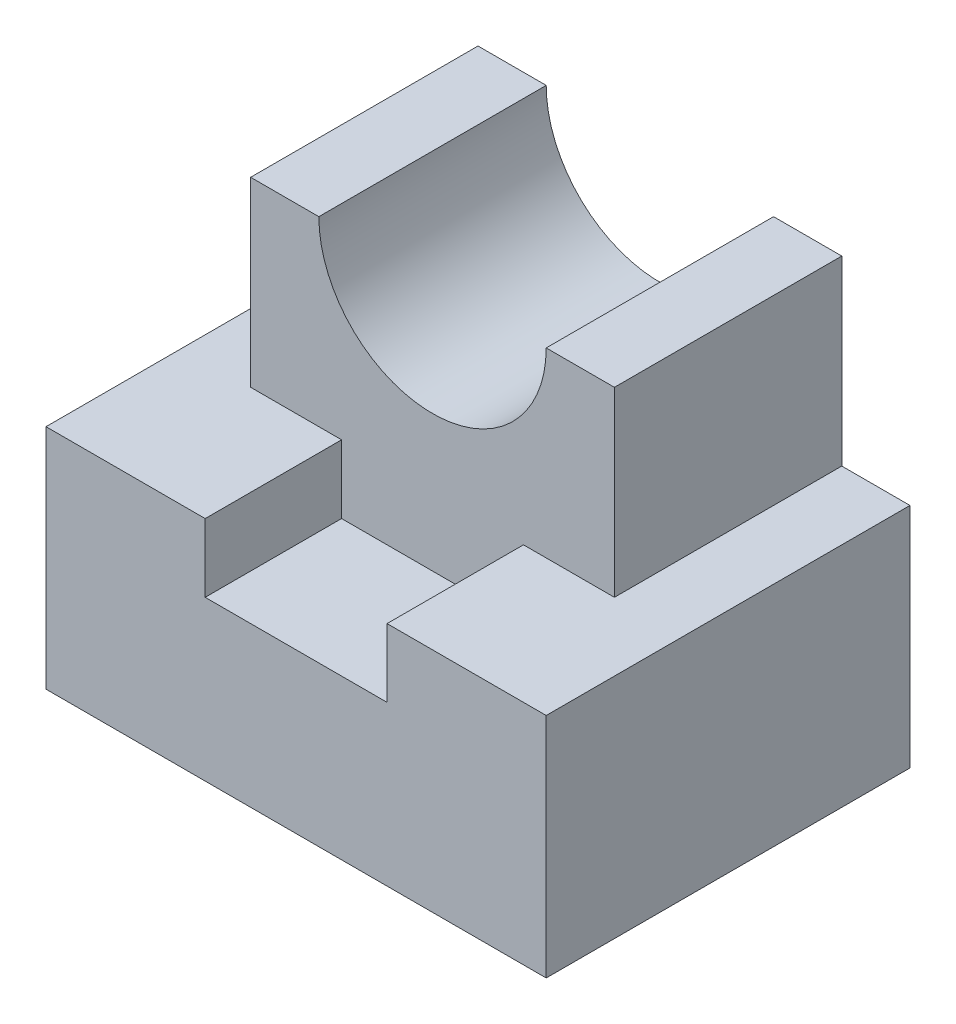
ISO-10303-21;
HEADER;
FILE_DESCRIPTION(('STEP AP214'),'2;1');
FILE_NAME('part.step','',(''),(''),'','','');
FILE_SCHEMA(('AUTOMOTIVE_DESIGN { 1 0 10303 214 1 1 1 1 }'));
ENDSEC;
DATA;
#1=APPLICATION_CONTEXT('core data for automotive mechanical design processes');
#2=APPLICATION_PROTOCOL_DEFINITION('international standard','automotive_design',2000,#1);
#3=PRODUCT_CONTEXT('',#1,'mechanical');
#4=PRODUCT('Part','Part','',(#3));
#5=PRODUCT_RELATED_PRODUCT_CATEGORY('part','',(#4));
#6=PRODUCT_DEFINITION_FORMATION('','',#4);
#7=PRODUCT_DEFINITION_CONTEXT('part definition',#1,'design');
#8=PRODUCT_DEFINITION('design','',#6,#7);
#9=PRODUCT_DEFINITION_SHAPE('','',#8);
#10=(LENGTH_UNIT() NAMED_UNIT(*) SI_UNIT(.MILLI.,.METRE.));
#11=(NAMED_UNIT(*) PLANE_ANGLE_UNIT() SI_UNIT($,.RADIAN.));
#12=(NAMED_UNIT(*) SI_UNIT($,.STERADIAN.) SOLID_ANGLE_UNIT());
#13=UNCERTAINTY_MEASURE_WITH_UNIT(LENGTH_MEASURE(1.E-05),#10,'distance_accuracy_value','');
#14=(GEOMETRIC_REPRESENTATION_CONTEXT(3) GLOBAL_UNCERTAINTY_ASSIGNED_CONTEXT((#13)) GLOBAL_UNIT_ASSIGNED_CONTEXT((#10,
#11,#12)) REPRESENTATION_CONTEXT('',''));
#15=CARTESIAN_POINT('',(0.,0.,0.));
#16=DIRECTION('',(0.,0.,1.));
#17=DIRECTION('',(1.,0.,0.));
#18=AXIS2_PLACEMENT_3D('',#15,#16,#17);
#19=CARTESIAN_POINT('',(0.,50.,0.));
#20=DIRECTION('',(0.,1.,0.));
#21=DIRECTION('',(0.,0.,1.));
#22=AXIS2_PLACEMENT_3D('',#19,#20,#21);
#23=PLANE('',#22);
#24=DIRECTION('',(0.,0.,1.));
#25=VECTOR('',#24,1.);
#26=CARTESIAN_POINT('',(-20.,50.,-32.7200187265876));
#27=LINE('',#26,#25);
#28=CARTESIAN_POINT('',(-20.,50.,10.));
#29=VERTEX_POINT('',#28);
#30=CARTESIAN_POINT('',(-20.,50.,40.));
#31=VERTEX_POINT('',#30);
#32=EDGE_CURVE('E141',#29,#31,#27,.T.);
#33=ORIENTED_EDGE('',*,*,#32,.F.);
#34=DIRECTION('',(1.,0.,0.));
#35=VECTOR('',#34,1.);
#36=CARTESIAN_POINT('',(0.,50.,10.));
#37=LINE('',#36,#35);
#38=CARTESIAN_POINT('',(-40.,50.,10.));
#39=VERTEX_POINT('',#38);
#40=EDGE_CURVE('E196',#39,#29,#37,.T.);
#41=ORIENTED_EDGE('',*,*,#40,.F.);
#42=DIRECTION('',(0.,0.,1.));
#43=VECTOR('',#42,1.);
#44=CARTESIAN_POINT('',(-40.,50.,0.));
#45=LINE('',#44,#43);
#46=CARTESIAN_POINT('',(-40.,50.,-40.));
#47=VERTEX_POINT('',#46);
#48=EDGE_CURVE('E198',#47,#39,#45,.T.);
#49=ORIENTED_EDGE('',*,*,#48,.F.);
#50=DIRECTION('',(-1.,0.,0.));
#51=VECTOR('',#50,1.);
#52=CARTESIAN_POINT('',(-55.,50.,-40.));
#53=LINE('',#52,#51);
#54=CARTESIAN_POINT('',(-55.,50.,-40.));
#55=VERTEX_POINT('',#54);
#56=EDGE_CURVE('E212',#47,#55,#53,.T.);
#57=ORIENTED_EDGE('',*,*,#56,.T.);
#58=DIRECTION('',(0.,0.,1.));
#59=VECTOR('',#58,1.);
#60=CARTESIAN_POINT('',(-55.,50.,-40.));
#61=LINE('',#60,#59);
#62=CARTESIAN_POINT('',(-55.,50.,40.));
#63=VERTEX_POINT('',#62);
#64=EDGE_CURVE('E202',#55,#63,#61,.T.);
#65=ORIENTED_EDGE('',*,*,#64,.T.);
#66=DIRECTION('',(1.,0.,0.));
#67=VECTOR('',#66,1.);
#68=CARTESIAN_POINT('',(-55.,50.,40.));
#69=LINE('',#68,#67);
#70=EDGE_CURVE('E207',#63,#31,#69,.T.);
#71=ORIENTED_EDGE('',*,*,#70,.T.);
#72=EDGE_LOOP('',(#33,#41,#49,#57,#65,#71));
#73=FACE_BOUND('',#72,.T.);
#74=ADVANCED_FACE('F33',(#73),#23,.T.);
#75=CARTESIAN_POINT('',(0.,90.,0.));
#76=DIRECTION('',(0.,1.,0.));
#77=DIRECTION('',(0.,0.,1.));
#78=AXIS2_PLACEMENT_3D('',#75,#76,#77);
#79=PLANE('',#78);
#80=DIRECTION('',(0.,0.,-1.));
#81=VECTOR('',#80,1.);
#82=CARTESIAN_POINT('',(25.,90.,40.));
#83=LINE('',#82,#81);
#84=CARTESIAN_POINT('',(25.,90.,10.));
#85=VERTEX_POINT('',#84);
#86=CARTESIAN_POINT('',(25.,90.,-40.));
#87=VERTEX_POINT('',#86);
#88=EDGE_CURVE('E41',#85,#87,#83,.T.);
#89=ORIENTED_EDGE('',*,*,#88,.F.);
#90=DIRECTION('',(-1.,0.,0.));
#91=VECTOR('',#90,1.);
#92=CARTESIAN_POINT('',(-40.,90.,10.));
#93=LINE('',#92,#91);
#94=CARTESIAN_POINT('',(40.,90.,10.));
#95=VERTEX_POINT('',#94);
#96=EDGE_CURVE('E177',#95,#85,#93,.T.);
#97=ORIENTED_EDGE('',*,*,#96,.F.);
#98=DIRECTION('',(0.,0.,1.));
#99=VECTOR('',#98,1.);
#100=CARTESIAN_POINT('',(40.,90.,-40.));
#101=LINE('',#100,#99);
#102=CARTESIAN_POINT('',(40.,90.,-40.));
#103=VERTEX_POINT('',#102);
#104=EDGE_CURVE('E173',#103,#95,#101,.T.);
#105=ORIENTED_EDGE('',*,*,#104,.F.);
#106=DIRECTION('',(1.,0.,0.));
#107=VECTOR('',#106,1.);
#108=CARTESIAN_POINT('',(-40.,90.,-40.));
#109=LINE('',#108,#107);
#110=EDGE_CURVE('E169',#87,#103,#109,.T.);
#111=ORIENTED_EDGE('',*,*,#110,.F.);
#112=EDGE_LOOP('',(#89,#97,#105,#111));
#113=FACE_BOUND('',#112,.T.);
#114=ADVANCED_FACE('F245',(#113),#79,.T.);
#115=CARTESIAN_POINT('',(-55.,50.,-40.));
#116=DIRECTION('',(1.,0.,0.));
#117=DIRECTION('',(0.,0.,-1.));
#118=AXIS2_PLACEMENT_3D('',#115,#116,#117);
#119=PLANE('',#118);
#120=DIRECTION('',(0.,0.,1.));
#121=VECTOR('',#120,1.);
#122=CARTESIAN_POINT('',(-55.,0.,-40.));
#123=LINE('',#122,#121);
#124=CARTESIAN_POINT('',(-55.,0.,-40.));
#125=VERTEX_POINT('',#124);
#126=CARTESIAN_POINT('',(-55.,0.,40.));
#127=VERTEX_POINT('',#126);
#128=EDGE_CURVE('E201',#125,#127,#123,.T.);
#129=ORIENTED_EDGE('',*,*,#128,.T.);
#130=DIRECTION('',(0.,-1.,0.));
#131=VECTOR('',#130,1.);
#132=CARTESIAN_POINT('',(-55.,50.,40.));
#133=LINE('',#132,#131);
#134=EDGE_CURVE('E231',#63,#127,#133,.T.);
#135=ORIENTED_EDGE('',*,*,#134,.F.);
#136=ORIENTED_EDGE('',*,*,#64,.F.);
#137=DIRECTION('',(0.,-1.,0.));
#138=VECTOR('',#137,1.);
#139=CARTESIAN_POINT('',(-55.,50.,-40.));
#140=LINE('',#139,#138);
#141=EDGE_CURVE('E215',#55,#125,#140,.T.);
#142=ORIENTED_EDGE('',*,*,#141,.T.);
#143=EDGE_LOOP('',(#129,#135,#136,#142));
#144=FACE_BOUND('',#143,.T.);
#145=ADVANCED_FACE('F35',(#144),#119,.F.);
#146=CARTESIAN_POINT('',(-55.,50.,40.));
#147=DIRECTION('',(0.,0.,-1.));
#148=DIRECTION('',(-1.,0.,0.));
#149=AXIS2_PLACEMENT_3D('',#146,#147,#148);
#150=PLANE('',#149);
#151=DIRECTION('',(-1.,0.,0.));
#152=VECTOR('',#151,1.);
#153=CARTESIAN_POINT('',(-55.,35.,40.));
#154=LINE('',#153,#152);
#155=CARTESIAN_POINT('',(20.,35.,40.));
#156=VERTEX_POINT('',#155);
#157=CARTESIAN_POINT('',(-20.,35.,40.));
#158=VERTEX_POINT('',#157);
#159=EDGE_CURVE('E11',#156,#158,#154,.T.);
#160=ORIENTED_EDGE('',*,*,#159,.T.);
#161=DIRECTION('',(0.,1.,0.));
#162=VECTOR('',#161,1.);
#163=CARTESIAN_POINT('',(-20.,50.,40.));
#164=LINE('',#163,#162);
#165=EDGE_CURVE('E156',#158,#31,#164,.T.);
#166=ORIENTED_EDGE('',*,*,#165,.T.);
#167=ORIENTED_EDGE('',*,*,#70,.F.);
#168=ORIENTED_EDGE('',*,*,#134,.T.);
#169=DIRECTION('',(1.,0.,0.));
#170=VECTOR('',#169,1.);
#171=CARTESIAN_POINT('',(-55.,0.,40.));
#172=LINE('',#171,#170);
#173=CARTESIAN_POINT('',(55.,0.,40.));
#174=VERTEX_POINT('',#173);
#175=EDGE_CURVE('E218',#127,#174,#172,.T.);
#176=ORIENTED_EDGE('',*,*,#175,.T.);
#177=DIRECTION('',(0.,-1.,0.));
#178=VECTOR('',#177,1.);
#179=CARTESIAN_POINT('',(55.,50.,40.));
#180=LINE('',#179,#178);
#181=CARTESIAN_POINT('',(55.,50.,40.));
#182=VERTEX_POINT('',#181);
#183=EDGE_CURVE('E228',#182,#174,#180,.T.);
#184=ORIENTED_EDGE('',*,*,#183,.F.);
#185=CARTESIAN_POINT('',(20.,50.,40.));
#186=VERTEX_POINT('',#185);
#187=EDGE_CURVE('E205',#186,#182,#69,.T.);
#188=ORIENTED_EDGE('',*,*,#187,.F.);
#189=DIRECTION('',(0.,-1.,0.));
#190=VECTOR('',#189,1.);
#191=CARTESIAN_POINT('',(20.,50.,40.));
#192=LINE('',#191,#190);
#193=EDGE_CURVE('E154',#186,#156,#192,.T.);
#194=ORIENTED_EDGE('',*,*,#193,.T.);
#195=EDGE_LOOP('',(#160,#166,#167,#168,#176,#184,#188,#194));
#196=FACE_BOUND('',#195,.T.);
#197=ADVANCED_FACE('F279',(#196),#150,.F.);
#198=CARTESIAN_POINT('',(55.,50.,-40.));
#199=DIRECTION('',(-1.,0.,0.));
#200=DIRECTION('',(0.,0.,1.));
#201=AXIS2_PLACEMENT_3D('',#198,#199,#200);
#202=PLANE('',#201);
#203=DIRECTION('',(0.,0.,-1.));
#204=VECTOR('',#203,1.);
#205=CARTESIAN_POINT('',(55.,0.,-40.));
#206=LINE('',#205,#204);
#207=CARTESIAN_POINT('',(55.,0.,-40.));
#208=VERTEX_POINT('',#207);
#209=EDGE_CURVE('E220',#174,#208,#206,.T.);
#210=ORIENTED_EDGE('',*,*,#209,.T.);
#211=DIRECTION('',(0.,-1.,0.));
#212=VECTOR('',#211,1.);
#213=CARTESIAN_POINT('',(55.,50.,-40.));
#214=LINE('',#213,#212);
#215=CARTESIAN_POINT('',(55.,50.,-40.));
#216=VERTEX_POINT('',#215);
#217=EDGE_CURVE('E225',#216,#208,#214,.T.);
#218=ORIENTED_EDGE('',*,*,#217,.F.);
#219=DIRECTION('',(0.,0.,-1.));
#220=VECTOR('',#219,1.);
#221=CARTESIAN_POINT('',(55.,50.,-40.));
#222=LINE('',#221,#220);
#223=EDGE_CURVE('E210',#182,#216,#222,.T.);
#224=ORIENTED_EDGE('',*,*,#223,.F.);
#225=ORIENTED_EDGE('',*,*,#183,.T.);
#226=EDGE_LOOP('',(#210,#218,#224,#225));
#227=FACE_BOUND('',#226,.T.);
#228=ADVANCED_FACE('F258',(#227),#202,.F.);
#229=CARTESIAN_POINT('',(-55.,50.,-40.));
#230=DIRECTION('',(0.,0.,1.));
#231=DIRECTION('',(1.,0.,0.));
#232=AXIS2_PLACEMENT_3D('',#229,#230,#231);
#233=PLANE('',#232);
#234=CARTESIAN_POINT('',(-40.,90.,-40.));
#235=VERTEX_POINT('',#234);
#236=CARTESIAN_POINT('',(-25.,90.,-40.));
#237=VERTEX_POINT('',#236);
#238=EDGE_CURVE('E170',#235,#237,#109,.T.);
#239=ORIENTED_EDGE('',*,*,#238,.T.);
#240=CARTESIAN_POINT('',(0.,90.,-40.));
#241=DIRECTION('',(0.,0.,-1.));
#242=DIRECTION('',(-1.,0.,0.));
#243=AXIS2_PLACEMENT_3D('',#240,#241,#242);
#244=CIRCLE('',#243,25.);
#245=EDGE_CURVE('E56',#87,#237,#244,.T.);
#246=ORIENTED_EDGE('',*,*,#245,.F.);
#247=ORIENTED_EDGE('',*,*,#110,.T.);
#248=DIRECTION('',(0.,-1.,0.));
#249=VECTOR('',#248,1.);
#250=CARTESIAN_POINT('',(40.,90.,-40.));
#251=LINE('',#250,#249);
#252=CARTESIAN_POINT('',(40.,50.,-40.));
#253=VERTEX_POINT('',#252);
#254=EDGE_CURVE('E188',#103,#253,#251,.T.);
#255=ORIENTED_EDGE('',*,*,#254,.T.);
#256=EDGE_CURVE('E213',#216,#253,#53,.T.);
#257=ORIENTED_EDGE('',*,*,#256,.F.);
#258=ORIENTED_EDGE('',*,*,#217,.T.);
#259=DIRECTION('',(-1.,0.,0.));
#260=VECTOR('',#259,1.);
#261=CARTESIAN_POINT('',(-55.,0.,-40.));
#262=LINE('',#261,#260);
#263=EDGE_CURVE('E206',#208,#125,#262,.T.);
#264=ORIENTED_EDGE('',*,*,#263,.T.);
#265=ORIENTED_EDGE('',*,*,#141,.F.);
#266=ORIENTED_EDGE('',*,*,#56,.F.);
#267=DIRECTION('',(0.,-1.,0.));
#268=VECTOR('',#267,1.);
#269=CARTESIAN_POINT('',(-40.,90.,-40.));
#270=LINE('',#269,#268);
#271=EDGE_CURVE('E180',#235,#47,#270,.T.);
#272=ORIENTED_EDGE('',*,*,#271,.F.);
#273=EDGE_LOOP('',(#239,#246,#247,#255,#257,#258,#264,#265,#266,#272));
#274=FACE_BOUND('',#273,.T.);
#275=ADVANCED_FACE('F241',(#274),#233,.F.);
#276=DIRECTION('',(0.,0.,1.));
#277=VECTOR('',#276,1.);
#278=CARTESIAN_POINT('',(20.,50.,-32.7200187265876));
#279=LINE('',#278,#277);
#280=CARTESIAN_POINT('',(20.,50.,10.));
#281=VERTEX_POINT('',#280);
#282=EDGE_CURVE('E48',#281,#186,#279,.T.);
#283=ORIENTED_EDGE('',*,*,#282,.T.);
#284=ORIENTED_EDGE('',*,*,#187,.T.);
#285=ORIENTED_EDGE('',*,*,#223,.T.);
#286=ORIENTED_EDGE('',*,*,#256,.T.);
#287=DIRECTION('',(0.,0.,-1.));
#288=VECTOR('',#287,1.);
#289=CARTESIAN_POINT('',(40.,50.,0.));
#290=LINE('',#289,#288);
#291=CARTESIAN_POINT('',(40.,50.,10.));
#292=VERTEX_POINT('',#291);
#293=EDGE_CURVE('E184',#292,#253,#290,.T.);
#294=ORIENTED_EDGE('',*,*,#293,.F.);
#295=EDGE_CURVE('E195',#281,#292,#37,.T.);
#296=ORIENTED_EDGE('',*,*,#295,.F.);
#297=EDGE_LOOP('',(#283,#284,#285,#286,#294,#296));
#298=FACE_BOUND('',#297,.T.);
#299=ADVANCED_FACE('F253',(#298),#23,.T.);
#300=CARTESIAN_POINT('',(0.,0.,0.));
#301=DIRECTION('',(0.,1.,0.));
#302=DIRECTION('',(0.,0.,1.));
#303=AXIS2_PLACEMENT_3D('',#300,#301,#302);
#304=PLANE('',#303);
#305=ORIENTED_EDGE('',*,*,#128,.F.);
#306=ORIENTED_EDGE('',*,*,#263,.F.);
#307=ORIENTED_EDGE('',*,*,#209,.F.);
#308=ORIENTED_EDGE('',*,*,#175,.F.);
#309=EDGE_LOOP('',(#305,#306,#307,#308));
#310=FACE_BOUND('',#309,.T.);
#311=ADVANCED_FACE('F262',(#310),#304,.F.);
#312=CARTESIAN_POINT('',(-40.,90.,-40.));
#313=DIRECTION('',(-1.,0.,0.));
#314=DIRECTION('',(0.,0.,1.));
#315=AXIS2_PLACEMENT_3D('',#312,#313,#314);
#316=PLANE('',#315);
#317=ORIENTED_EDGE('',*,*,#271,.T.);
#318=ORIENTED_EDGE('',*,*,#48,.T.);
#319=DIRECTION('',(0.,-1.,0.));
#320=VECTOR('',#319,1.);
#321=CARTESIAN_POINT('',(-40.,90.,10.));
#322=LINE('',#321,#320);
#323=CARTESIAN_POINT('',(-40.,90.,10.));
#324=VERTEX_POINT('',#323);
#325=EDGE_CURVE('E181',#324,#39,#322,.T.);
#326=ORIENTED_EDGE('',*,*,#325,.F.);
#327=DIRECTION('',(0.,0.,-1.));
#328=VECTOR('',#327,1.);
#329=CARTESIAN_POINT('',(-40.,90.,-40.));
#330=LINE('',#329,#328);
#331=EDGE_CURVE('E166',#324,#235,#330,.T.);
#332=ORIENTED_EDGE('',*,*,#331,.T.);
#333=EDGE_LOOP('',(#317,#318,#326,#332));
#334=FACE_BOUND('',#333,.T.);
#335=ADVANCED_FACE('F276',(#334),#316,.T.);
#336=CARTESIAN_POINT('',(-40.,90.,10.));
#337=DIRECTION('',(0.,0.,1.));
#338=DIRECTION('',(1.,0.,0.));
#339=AXIS2_PLACEMENT_3D('',#336,#337,#338);
#340=PLANE('',#339);
#341=CARTESIAN_POINT('',(0.,90.,10.));
#342=DIRECTION('',(0.,0.,1.));
#343=DIRECTION('',(1.,0.,0.));
#344=AXIS2_PLACEMENT_3D('',#341,#342,#343);
#345=CIRCLE('',#344,25.);
#346=CARTESIAN_POINT('',(-25.,90.,10.));
#347=VERTEX_POINT('',#346);
#348=EDGE_CURVE('E164',#347,#85,#345,.T.);
#349=ORIENTED_EDGE('',*,*,#348,.F.);
#350=EDGE_CURVE('E176',#347,#324,#93,.T.);
#351=ORIENTED_EDGE('',*,*,#350,.T.);
#352=ORIENTED_EDGE('',*,*,#325,.T.);
#353=ORIENTED_EDGE('',*,*,#40,.T.);
#354=DIRECTION('',(0.,1.,0.));
#355=VECTOR('',#354,1.);
#356=CARTESIAN_POINT('',(-20.,50.,10.));
#357=LINE('',#356,#355);
#358=CARTESIAN_POINT('',(-20.,35.,10.));
#359=VERTEX_POINT('',#358);
#360=EDGE_CURVE('E140',#359,#29,#357,.T.);
#361=ORIENTED_EDGE('',*,*,#360,.F.);
#362=DIRECTION('',(-1.,0.,0.));
#363=VECTOR('',#362,1.);
#364=CARTESIAN_POINT('',(-20.,35.,10.));
#365=LINE('',#364,#363);
#366=CARTESIAN_POINT('',(20.,35.,10.));
#367=VERTEX_POINT('',#366);
#368=EDGE_CURVE('E146',#367,#359,#365,.T.);
#369=ORIENTED_EDGE('',*,*,#368,.F.);
#370=DIRECTION('',(0.,-1.,0.));
#371=VECTOR('',#370,1.);
#372=CARTESIAN_POINT('',(20.,50.,10.));
#373=LINE('',#372,#371);
#374=EDGE_CURVE('E132',#281,#367,#373,.T.);
#375=ORIENTED_EDGE('',*,*,#374,.F.);
#376=ORIENTED_EDGE('',*,*,#295,.T.);
#377=DIRECTION('',(0.,-1.,0.));
#378=VECTOR('',#377,1.);
#379=CARTESIAN_POINT('',(40.,90.,10.));
#380=LINE('',#379,#378);
#381=EDGE_CURVE('E185',#95,#292,#380,.T.);
#382=ORIENTED_EDGE('',*,*,#381,.F.);
#383=ORIENTED_EDGE('',*,*,#96,.T.);
#384=EDGE_LOOP('',(#349,#351,#352,#353,#361,#369,#375,#376,#382,#383));
#385=FACE_BOUND('',#384,.T.);
#386=ADVANCED_FACE('F151',(#385),#340,.T.);
#387=CARTESIAN_POINT('',(40.,90.,-40.));
#388=DIRECTION('',(1.,0.,0.));
#389=DIRECTION('',(0.,0.,-1.));
#390=AXIS2_PLACEMENT_3D('',#387,#388,#389);
#391=PLANE('',#390);
#392=ORIENTED_EDGE('',*,*,#381,.T.);
#393=ORIENTED_EDGE('',*,*,#293,.T.);
#394=ORIENTED_EDGE('',*,*,#254,.F.);
#395=ORIENTED_EDGE('',*,*,#104,.T.);
#396=EDGE_LOOP('',(#392,#393,#394,#395));
#397=FACE_BOUND('',#396,.T.);
#398=ADVANCED_FACE('F247',(#397),#391,.T.);
#399=DIRECTION('',(0.,0.,-1.));
#400=VECTOR('',#399,1.);
#401=CARTESIAN_POINT('',(-25.,90.,40.));
#402=LINE('',#401,#400);
#403=EDGE_CURVE('E234',#237,#347,#402,.F.);
#404=ORIENTED_EDGE('',*,*,#403,.F.);
#405=ORIENTED_EDGE('',*,*,#238,.F.);
#406=ORIENTED_EDGE('',*,*,#331,.F.);
#407=ORIENTED_EDGE('',*,*,#350,.F.);
#408=EDGE_LOOP('',(#404,#405,#406,#407));
#409=FACE_BOUND('',#408,.T.);
#410=ADVANCED_FACE('F273',(#409),#79,.T.);
#411=CARTESIAN_POINT('',(0.,90.,40.));
#412=DIRECTION('',(0.,0.,-1.));
#413=DIRECTION('',(-1.,0.,0.));
#414=AXIS2_PLACEMENT_3D('',#411,#412,#413);
#415=CYLINDRICAL_SURFACE('',#414,25.);
#416=ORIENTED_EDGE('',*,*,#88,.T.);
#417=ORIENTED_EDGE('',*,*,#245,.T.);
#418=ORIENTED_EDGE('',*,*,#403,.T.);
#419=ORIENTED_EDGE('',*,*,#348,.T.);
#420=EDGE_LOOP('',(#416,#417,#418,#419));
#421=FACE_BOUND('',#420,.T.);
#422=ADVANCED_FACE('F236',(#421),#415,.F.);
#423=CARTESIAN_POINT('',(-20.,35.,-32.7200187265876));
#424=DIRECTION('',(0.,-1.,0.));
#425=DIRECTION('',(0.,0.,-1.));
#426=AXIS2_PLACEMENT_3D('',#423,#424,#425);
#427=PLANE('',#426);
#428=DIRECTION('',(0.,0.,1.));
#429=VECTOR('',#428,1.);
#430=CARTESIAN_POINT('',(20.,35.,-32.7200187265876));
#431=LINE('',#430,#429);
#432=EDGE_CURVE('E135',#367,#156,#431,.T.);
#433=ORIENTED_EDGE('',*,*,#432,.F.);
#434=ORIENTED_EDGE('',*,*,#368,.T.);
#435=DIRECTION('',(0.,0.,1.));
#436=VECTOR('',#435,1.);
#437=CARTESIAN_POINT('',(-20.,35.,-32.7200187265876));
#438=LINE('',#437,#436);
#439=EDGE_CURVE('E148',#359,#158,#438,.T.);
#440=ORIENTED_EDGE('',*,*,#439,.T.);
#441=ORIENTED_EDGE('',*,*,#159,.F.);
#442=EDGE_LOOP('',(#433,#434,#440,#441));
#443=FACE_BOUND('',#442,.T.);
#444=ADVANCED_FACE('F144',(#443),#427,.F.);
#445=CARTESIAN_POINT('',(-20.,50.,-32.7200187265876));
#446=DIRECTION('',(-1.,0.,0.));
#447=DIRECTION('',(0.,-1.,0.));
#448=AXIS2_PLACEMENT_3D('',#445,#446,#447);
#449=PLANE('',#448);
#450=ORIENTED_EDGE('',*,*,#439,.F.);
#451=ORIENTED_EDGE('',*,*,#360,.T.);
#452=ORIENTED_EDGE('',*,*,#32,.T.);
#453=ORIENTED_EDGE('',*,*,#165,.F.);
#454=EDGE_LOOP('',(#450,#451,#452,#453));
#455=FACE_BOUND('',#454,.T.);
#456=ADVANCED_FACE('F281',(#455),#449,.F.);
#457=CARTESIAN_POINT('',(20.,50.,-32.7200187265876));
#458=DIRECTION('',(1.,0.,0.));
#459=DIRECTION('',(0.,1.,0.));
#460=AXIS2_PLACEMENT_3D('',#457,#458,#459);
#461=PLANE('',#460);
#462=ORIENTED_EDGE('',*,*,#282,.F.);
#463=ORIENTED_EDGE('',*,*,#374,.T.);
#464=ORIENTED_EDGE('',*,*,#432,.T.);
#465=ORIENTED_EDGE('',*,*,#193,.F.);
#466=EDGE_LOOP('',(#462,#463,#464,#465));
#467=FACE_BOUND('',#466,.T.);
#468=ADVANCED_FACE('F134',(#467),#461,.F.);
#469=CLOSED_SHELL('',(#74,#114,#145,#197,#228,#275,#299,#311,#335,#386,#398,#410,#422,#444,#456,#468));
#470=MANIFOLD_SOLID_BREP('B2',#469);
#471=ADVANCED_BREP_SHAPE_REPRESENTATION('',(#18,#470),#14);
#472=SHAPE_DEFINITION_REPRESENTATION(#9,#471);
ENDSEC;
END-ISO-10303-21;
